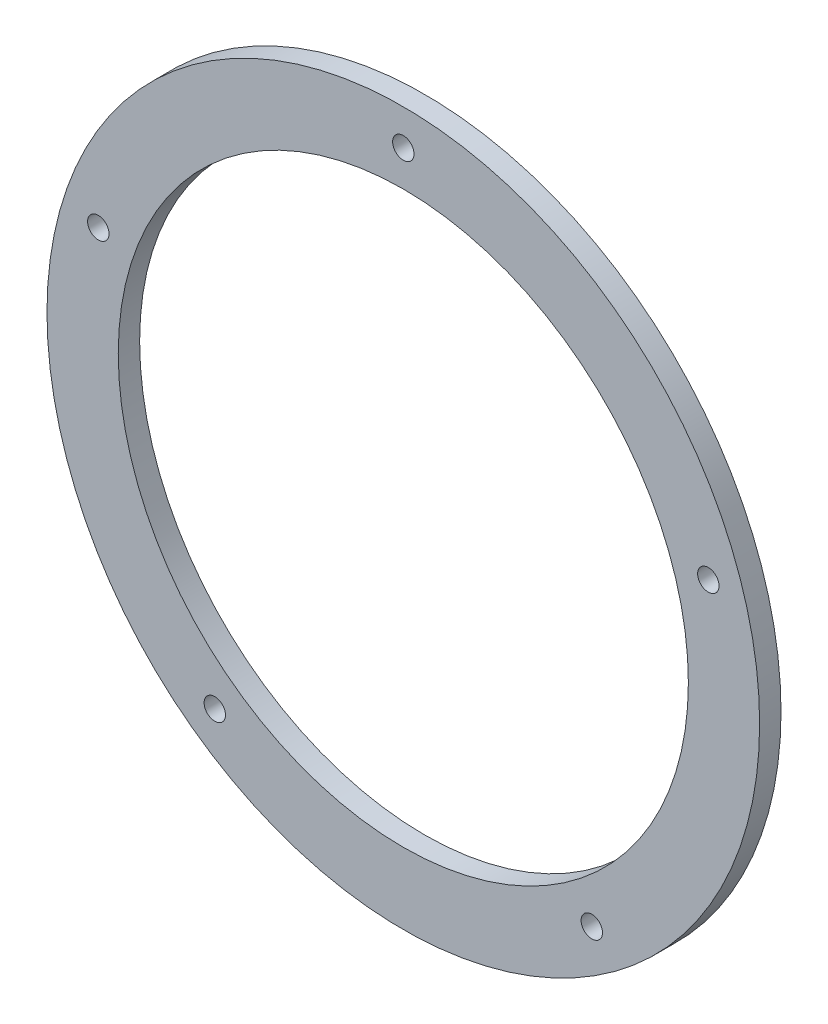
ISO-10303-21;
HEADER;
FILE_DESCRIPTION(('STEP AP214'),'2;1');
FILE_NAME('part.step','',(''),(''),'','','');
FILE_SCHEMA(('AUTOMOTIVE_DESIGN { 1 0 10303 214 1 1 1 1 }'));
ENDSEC;
DATA;
#1=APPLICATION_CONTEXT('core data for automotive mechanical design processes');
#2=APPLICATION_PROTOCOL_DEFINITION('international standard','automotive_design',2000,#1);
#3=PRODUCT_CONTEXT('',#1,'mechanical');
#4=PRODUCT('Part','Part','',(#3));
#5=PRODUCT_RELATED_PRODUCT_CATEGORY('part','',(#4));
#6=PRODUCT_DEFINITION_FORMATION('','',#4);
#7=PRODUCT_DEFINITION_CONTEXT('part definition',#1,'design');
#8=PRODUCT_DEFINITION('design','',#6,#7);
#9=PRODUCT_DEFINITION_SHAPE('','',#8);
#10=(LENGTH_UNIT() NAMED_UNIT(*) SI_UNIT(.MILLI.,.METRE.));
#11=(NAMED_UNIT(*) PLANE_ANGLE_UNIT() SI_UNIT($,.RADIAN.));
#12=(NAMED_UNIT(*) SI_UNIT($,.STERADIAN.) SOLID_ANGLE_UNIT());
#13=UNCERTAINTY_MEASURE_WITH_UNIT(LENGTH_MEASURE(1.E-05),#10,'distance_accuracy_value','');
#14=(GEOMETRIC_REPRESENTATION_CONTEXT(3) GLOBAL_UNCERTAINTY_ASSIGNED_CONTEXT((#13)) GLOBAL_UNIT_ASSIGNED_CONTEXT((#10,
#11,#12)) REPRESENTATION_CONTEXT('',''));
#15=CARTESIAN_POINT('',(0.,0.,0.));
#16=DIRECTION('',(0.,0.,1.));
#17=DIRECTION('',(1.,0.,0.));
#18=AXIS2_PLACEMENT_3D('',#15,#16,#17);
#19=CARTESIAN_POINT('',(0.,0.,3.));
#20=DIRECTION('',(0.,0.,1.));
#21=DIRECTION('',(1.,0.,0.));
#22=AXIS2_PLACEMENT_3D('',#19,#20,#21);
#23=PLANE('',#22);
#24=CARTESIAN_POINT('',(-42.797543233282,13.9057647468725,3.));
#25=DIRECTION('',(0.,0.,1.));
#26=DIRECTION('',(0.309016994374945,0.951056516295155,0.));
#27=AXIS2_PLACEMENT_3D('',#24,#25,#26);
#28=CIRCLE('',#27,1.5);
#29=CARTESIAN_POINT('',(-42.3340177417195,15.3323495213153,3.));
#30=VERTEX_POINT('',#29);
#31=EDGE_CURVE('E74',#30,#30,#28,.T.);
#32=ORIENTED_EDGE('',*,*,#31,.F.);
#33=EDGE_LOOP('',(#32));
#34=FACE_BOUND('',#33,.T.);
#35=CARTESIAN_POINT('',(-26.4503363531611,-36.4057647468728,3.));
#36=DIRECTION('',(0.,0.,1.));
#37=DIRECTION('',(-0.809016994374951,0.587785252292469,0.));
#38=AXIS2_PLACEMENT_3D('',#35,#36,#37);
#39=CIRCLE('',#38,1.5);
#40=CARTESIAN_POINT('',(-27.6638618447235,-35.5240868684341,3.));
#41=VERTEX_POINT('',#40);
#42=EDGE_CURVE('E68',#41,#41,#39,.T.);
#43=ORIENTED_EDGE('',*,*,#42,.F.);
#44=EDGE_LOOP('',(#43));
#45=FACE_BOUND('',#44,.T.);
#46=CARTESIAN_POINT('',(26.4503363531616,-36.4057647468724,3.));
#47=DIRECTION('',(0.,0.,1.));
#48=DIRECTION('',(-0.809016994374942,-0.58778525229248,0.));
#49=AXIS2_PLACEMENT_3D('',#46,#47,#48);
#50=CIRCLE('',#49,1.5);
#51=CARTESIAN_POINT('',(25.2368108615992,-37.2874426253111,3.));
#52=VERTEX_POINT('',#51);
#53=EDGE_CURVE('E62',#52,#52,#50,.T.);
#54=ORIENTED_EDGE('',*,*,#53,.F.);
#55=EDGE_LOOP('',(#54));
#56=FACE_BOUND('',#55,.T.);
#57=CARTESIAN_POINT('',(42.7975432332818,13.9057647468731,3.));
#58=DIRECTION('',(0.,0.,1.));
#59=DIRECTION('',(0.309016994374958,-0.95105651629515,0.));
#60=AXIS2_PLACEMENT_3D('',#57,#58,#59);
#61=CIRCLE('',#60,1.5);
#62=CARTESIAN_POINT('',(43.2610687248442,12.4791799724304,3.));
#63=VERTEX_POINT('',#62);
#64=EDGE_CURVE('E56',#63,#63,#61,.T.);
#65=ORIENTED_EDGE('',*,*,#64,.F.);
#66=EDGE_LOOP('',(#65));
#67=FACE_BOUND('',#66,.T.);
#68=CARTESIAN_POINT('',(0.,45.,3.));
#69=DIRECTION('',(0.,0.,1.));
#70=DIRECTION('',(1.,0.,0.));
#71=AXIS2_PLACEMENT_3D('',#68,#69,#70);
#72=CIRCLE('',#71,1.5);
#73=CARTESIAN_POINT('',(1.50000000000001,45.,3.));
#74=VERTEX_POINT('',#73);
#75=EDGE_CURVE('E50',#74,#74,#72,.T.);
#76=ORIENTED_EDGE('',*,*,#75,.F.);
#77=EDGE_LOOP('',(#76));
#78=FACE_BOUND('',#77,.T.);
#79=CARTESIAN_POINT('',(0.,0.,3.));
#80=DIRECTION('',(0.,0.,1.));
#81=DIRECTION('',(1.,0.,0.));
#82=AXIS2_PLACEMENT_3D('',#79,#80,#81);
#83=CIRCLE('',#82,50.);
#84=CARTESIAN_POINT('',(50.,0.,3.));
#85=VERTEX_POINT('',#84);
#86=EDGE_CURVE('E10',#85,#85,#83,.T.);
#87=ORIENTED_EDGE('',*,*,#86,.T.);
#88=EDGE_LOOP('',(#87));
#89=FACE_BOUND('',#88,.T.);
#90=CARTESIAN_POINT('',(0.,0.,3.));
#91=DIRECTION('',(0.,0.,1.));
#92=DIRECTION('',(1.,0.,0.));
#93=AXIS2_PLACEMENT_3D('',#90,#91,#92);
#94=CIRCLE('',#93,40.);
#95=CARTESIAN_POINT('',(40.,0.,3.));
#96=VERTEX_POINT('',#95);
#97=EDGE_CURVE('E42',#96,#96,#94,.T.);
#98=ORIENTED_EDGE('',*,*,#97,.F.);
#99=EDGE_LOOP('',(#98));
#100=FACE_BOUND('',#99,.T.);
#101=ADVANCED_FACE('F31',(#34,#45,#56,#67,#78,#89,#100),#23,.T.);
#102=CARTESIAN_POINT('',(0.,0.,0.));
#103=DIRECTION('',(0.,0.,1.));
#104=DIRECTION('',(1.,0.,0.));
#105=AXIS2_PLACEMENT_3D('',#102,#103,#104);
#106=PLANE('',#105);
#107=CARTESIAN_POINT('',(-42.797543233282,13.9057647468725,0.));
#108=DIRECTION('',(0.,0.,1.));
#109=DIRECTION('',(0.309016994374945,0.951056516295155,0.));
#110=AXIS2_PLACEMENT_3D('',#107,#108,#109);
#111=CIRCLE('',#110,1.5);
#112=CARTESIAN_POINT('',(-42.3340177417195,15.3323495213153,0.));
#113=VERTEX_POINT('',#112);
#114=EDGE_CURVE('E53',#113,#113,#111,.T.);
#115=ORIENTED_EDGE('',*,*,#114,.T.);
#116=EDGE_LOOP('',(#115));
#117=FACE_BOUND('',#116,.T.);
#118=CARTESIAN_POINT('',(-26.4503363531611,-36.4057647468728,0.));
#119=DIRECTION('',(0.,0.,1.));
#120=DIRECTION('',(-0.809016994374951,0.587785252292469,0.));
#121=AXIS2_PLACEMENT_3D('',#118,#119,#120);
#122=CIRCLE('',#121,1.5);
#123=CARTESIAN_POINT('',(-27.6638618447235,-35.5240868684341,0.));
#124=VERTEX_POINT('',#123);
#125=EDGE_CURVE('E71',#124,#124,#122,.T.);
#126=ORIENTED_EDGE('',*,*,#125,.T.);
#127=EDGE_LOOP('',(#126));
#128=FACE_BOUND('',#127,.T.);
#129=CARTESIAN_POINT('',(26.4503363531616,-36.4057647468724,0.));
#130=DIRECTION('',(0.,0.,1.));
#131=DIRECTION('',(-0.809016994374942,-0.58778525229248,0.));
#132=AXIS2_PLACEMENT_3D('',#129,#130,#131);
#133=CIRCLE('',#132,1.5);
#134=CARTESIAN_POINT('',(25.2368108615992,-37.2874426253111,0.));
#135=VERTEX_POINT('',#134);
#136=EDGE_CURVE('E65',#135,#135,#133,.T.);
#137=ORIENTED_EDGE('',*,*,#136,.T.);
#138=EDGE_LOOP('',(#137));
#139=FACE_BOUND('',#138,.T.);
#140=CARTESIAN_POINT('',(42.7975432332818,13.9057647468731,0.));
#141=DIRECTION('',(0.,0.,1.));
#142=DIRECTION('',(0.309016994374958,-0.95105651629515,0.));
#143=AXIS2_PLACEMENT_3D('',#140,#141,#142);
#144=CIRCLE('',#143,1.5);
#145=CARTESIAN_POINT('',(43.2610687248442,12.4791799724304,0.));
#146=VERTEX_POINT('',#145);
#147=EDGE_CURVE('E59',#146,#146,#144,.T.);
#148=ORIENTED_EDGE('',*,*,#147,.T.);
#149=EDGE_LOOP('',(#148));
#150=FACE_BOUND('',#149,.T.);
#151=CARTESIAN_POINT('',(0.,45.,0.));
#152=DIRECTION('',(0.,0.,1.));
#153=DIRECTION('',(1.,0.,0.));
#154=AXIS2_PLACEMENT_3D('',#151,#152,#153);
#155=CIRCLE('',#154,1.5);
#156=CARTESIAN_POINT('',(1.50000000000001,45.,0.));
#157=VERTEX_POINT('',#156);
#158=EDGE_CURVE('E47',#157,#157,#155,.T.);
#159=ORIENTED_EDGE('',*,*,#158,.T.);
#160=EDGE_LOOP('',(#159));
#161=FACE_BOUND('',#160,.T.);
#162=CARTESIAN_POINT('',(0.,0.,0.));
#163=DIRECTION('',(0.,0.,1.));
#164=DIRECTION('',(1.,0.,0.));
#165=AXIS2_PLACEMENT_3D('',#162,#163,#164);
#166=CIRCLE('',#165,50.);
#167=CARTESIAN_POINT('',(50.,0.,0.));
#168=VERTEX_POINT('',#167);
#169=EDGE_CURVE('E35',#168,#168,#166,.T.);
#170=ORIENTED_EDGE('',*,*,#169,.F.);
#171=EDGE_LOOP('',(#170));
#172=FACE_BOUND('',#171,.T.);
#173=CARTESIAN_POINT('',(0.,0.,0.));
#174=DIRECTION('',(0.,0.,1.));
#175=DIRECTION('',(1.,0.,0.));
#176=AXIS2_PLACEMENT_3D('',#173,#174,#175);
#177=CIRCLE('',#176,40.);
#178=CARTESIAN_POINT('',(40.,0.,0.));
#179=VERTEX_POINT('',#178);
#180=EDGE_CURVE('E44',#179,#179,#177,.T.);
#181=ORIENTED_EDGE('',*,*,#180,.T.);
#182=EDGE_LOOP('',(#181));
#183=FACE_BOUND('',#182,.T.);
#184=ADVANCED_FACE('F80',(#117,#128,#139,#150,#161,#172,#183),#106,.F.);
#185=CARTESIAN_POINT('',(0.,0.,3.));
#186=DIRECTION('',(0.,0.,-1.));
#187=DIRECTION('',(-1.,0.,0.));
#188=AXIS2_PLACEMENT_3D('',#185,#186,#187);
#189=CYLINDRICAL_SURFACE('',#188,50.);
#190=ORIENTED_EDGE('',*,*,#86,.F.);
#191=EDGE_LOOP('',(#190));
#192=FACE_BOUND('',#191,.T.);
#193=ORIENTED_EDGE('',*,*,#169,.T.);
#194=EDGE_LOOP('',(#193));
#195=FACE_BOUND('',#194,.T.);
#196=ADVANCED_FACE('F33',(#192,#195),#189,.T.);
#197=CARTESIAN_POINT('',(0.,0.,3.));
#198=DIRECTION('',(0.,0.,-1.));
#199=DIRECTION('',(-1.,0.,0.));
#200=AXIS2_PLACEMENT_3D('',#197,#198,#199);
#201=CYLINDRICAL_SURFACE('',#200,40.);
#202=ORIENTED_EDGE('',*,*,#97,.T.);
#203=EDGE_LOOP('',(#202));
#204=FACE_BOUND('',#203,.T.);
#205=ORIENTED_EDGE('',*,*,#180,.F.);
#206=EDGE_LOOP('',(#205));
#207=FACE_BOUND('',#206,.T.);
#208=ADVANCED_FACE('F103',(#204,#207),#201,.F.);
#209=CARTESIAN_POINT('',(0.,45.,0.));
#210=DIRECTION('',(0.,0.,1.));
#211=DIRECTION('',(1.,0.,0.));
#212=AXIS2_PLACEMENT_3D('',#209,#210,#211);
#213=CYLINDRICAL_SURFACE('',#212,1.5);
#214=ORIENTED_EDGE('',*,*,#158,.F.);
#215=EDGE_LOOP('',(#214));
#216=FACE_BOUND('',#215,.T.);
#217=ORIENTED_EDGE('',*,*,#75,.T.);
#218=EDGE_LOOP('',(#217));
#219=FACE_BOUND('',#218,.T.);
#220=ADVANCED_FACE('F106',(#216,#219),#213,.F.);
#221=CARTESIAN_POINT('',(42.7975432332818,13.9057647468731,0.));
#222=DIRECTION('',(0.,0.,1.));
#223=DIRECTION('',(1.,0.,0.));
#224=AXIS2_PLACEMENT_3D('',#221,#222,#223);
#225=CYLINDRICAL_SURFACE('',#224,1.5);
#226=ORIENTED_EDGE('',*,*,#147,.F.);
#227=EDGE_LOOP('',(#226));
#228=FACE_BOUND('',#227,.T.);
#229=ORIENTED_EDGE('',*,*,#64,.T.);
#230=EDGE_LOOP('',(#229));
#231=FACE_BOUND('',#230,.T.);
#232=ADVANCED_FACE('F118',(#228,#231),#225,.F.);
#233=CARTESIAN_POINT('',(26.4503363531616,-36.4057647468724,0.));
#234=DIRECTION('',(0.,0.,1.));
#235=DIRECTION('',(1.,0.,0.));
#236=AXIS2_PLACEMENT_3D('',#233,#234,#235);
#237=CYLINDRICAL_SURFACE('',#236,1.5);
#238=ORIENTED_EDGE('',*,*,#136,.F.);
#239=EDGE_LOOP('',(#238));
#240=FACE_BOUND('',#239,.T.);
#241=ORIENTED_EDGE('',*,*,#53,.T.);
#242=EDGE_LOOP('',(#241));
#243=FACE_BOUND('',#242,.T.);
#244=ADVANCED_FACE('F122',(#240,#243),#237,.F.);
#245=CARTESIAN_POINT('',(-26.4503363531611,-36.4057647468728,0.));
#246=DIRECTION('',(0.,0.,1.));
#247=DIRECTION('',(1.,0.,0.));
#248=AXIS2_PLACEMENT_3D('',#245,#246,#247);
#249=CYLINDRICAL_SURFACE('',#248,1.5);
#250=ORIENTED_EDGE('',*,*,#125,.F.);
#251=EDGE_LOOP('',(#250));
#252=FACE_BOUND('',#251,.T.);
#253=ORIENTED_EDGE('',*,*,#42,.T.);
#254=EDGE_LOOP('',(#253));
#255=FACE_BOUND('',#254,.T.);
#256=ADVANCED_FACE('F86',(#252,#255),#249,.F.);
#257=CARTESIAN_POINT('',(-42.797543233282,13.9057647468725,0.));
#258=DIRECTION('',(0.,0.,1.));
#259=DIRECTION('',(1.,0.,0.));
#260=AXIS2_PLACEMENT_3D('',#257,#258,#259);
#261=CYLINDRICAL_SURFACE('',#260,1.5);
#262=ORIENTED_EDGE('',*,*,#114,.F.);
#263=EDGE_LOOP('',(#262));
#264=FACE_BOUND('',#263,.T.);
#265=ORIENTED_EDGE('',*,*,#31,.T.);
#266=EDGE_LOOP('',(#265));
#267=FACE_BOUND('',#266,.T.);
#268=ADVANCED_FACE('F83',(#264,#267),#261,.F.);
#269=CLOSED_SHELL('',(#101,#184,#196,#208,#220,#232,#244,#256,#268));
#270=MANIFOLD_SOLID_BREP('B2',#269);
#271=ADVANCED_BREP_SHAPE_REPRESENTATION('',(#18,#270),#14);
#272=SHAPE_DEFINITION_REPRESENTATION(#9,#271);
ENDSEC;
END-ISO-10303-21;
